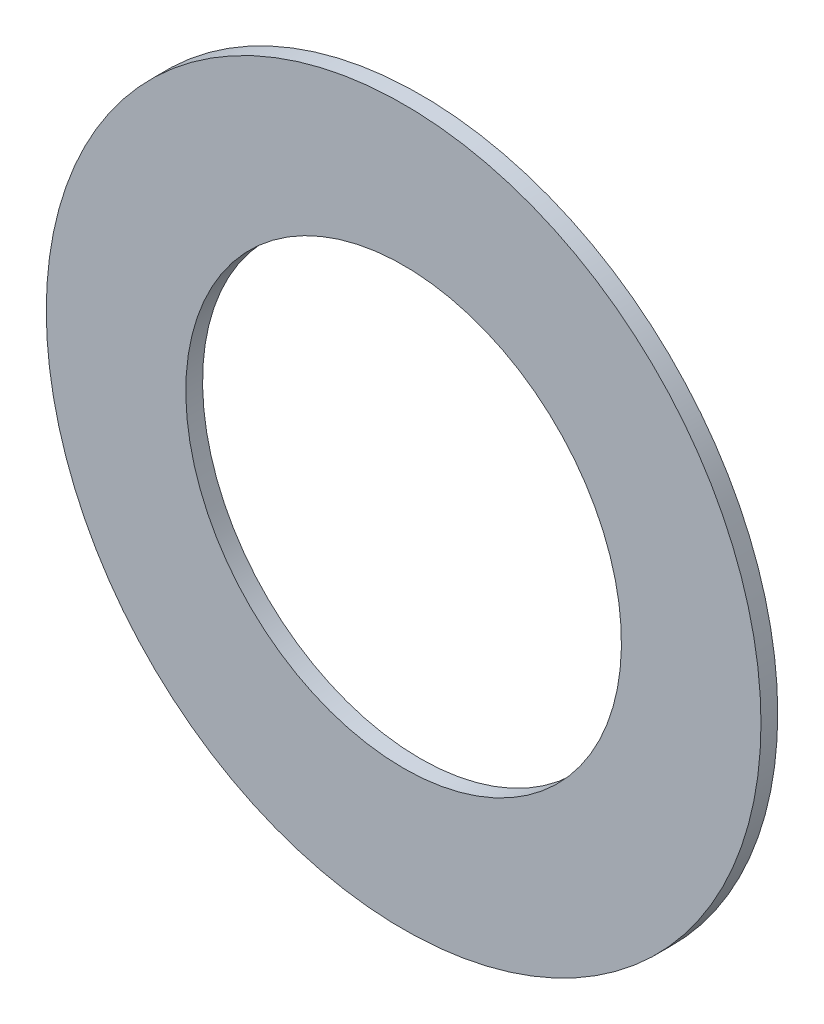
ISO-10303-21;
HEADER;
FILE_DESCRIPTION(('STEP AP214'),'2;1');
FILE_NAME('part.step','',(''),(''),'','','');
FILE_SCHEMA(('AUTOMOTIVE_DESIGN { 1 0 10303 214 1 1 1 1 }'));
ENDSEC;
DATA;
#1=APPLICATION_CONTEXT('core data for automotive mechanical design processes');
#2=APPLICATION_PROTOCOL_DEFINITION('international standard','automotive_design',2000,#1);
#3=PRODUCT_CONTEXT('',#1,'mechanical');
#4=PRODUCT('Part','Part','',(#3));
#5=PRODUCT_RELATED_PRODUCT_CATEGORY('part','',(#4));
#6=PRODUCT_DEFINITION_FORMATION('','',#4);
#7=PRODUCT_DEFINITION_CONTEXT('part definition',#1,'design');
#8=PRODUCT_DEFINITION('design','',#6,#7);
#9=PRODUCT_DEFINITION_SHAPE('','',#8);
#10=(LENGTH_UNIT() NAMED_UNIT(*) SI_UNIT(.MILLI.,.METRE.));
#11=(NAMED_UNIT(*) PLANE_ANGLE_UNIT() SI_UNIT($,.RADIAN.));
#12=(NAMED_UNIT(*) SI_UNIT($,.STERADIAN.) SOLID_ANGLE_UNIT());
#13=UNCERTAINTY_MEASURE_WITH_UNIT(LENGTH_MEASURE(1.E-05),#10,'distance_accuracy_value','');
#14=(GEOMETRIC_REPRESENTATION_CONTEXT(3) GLOBAL_UNCERTAINTY_ASSIGNED_CONTEXT((#13)) GLOBAL_UNIT_ASSIGNED_CONTEXT((#10,
#11,#12)) REPRESENTATION_CONTEXT('',''));
#15=CARTESIAN_POINT('',(0.,0.,0.));
#16=DIRECTION('',(0.,0.,1.));
#17=DIRECTION('',(1.,0.,0.));
#18=AXIS2_PLACEMENT_3D('',#15,#16,#17);
#19=CARTESIAN_POINT('',(63.17,-76.905,-0.045));
#20=DIRECTION('',(0.,0.,-1.));
#21=DIRECTION('',(0.,-1.,0.));
#22=AXIS2_PLACEMENT_3D('',#19,#20,#21);
#23=CYLINDRICAL_SURFACE('',#22,0.455);
#24=CARTESIAN_POINT('',(63.17,-76.905,1.6));
#25=DIRECTION('',(0.,0.,-1.));
#26=DIRECTION('',(0.,-1.,0.));
#27=AXIS2_PLACEMENT_3D('',#24,#25,#26);
#28=CIRCLE('',#27,0.455);
#29=CARTESIAN_POINT('',(63.17,-77.36,1.6));
#30=VERTEX_POINT('',#29);
#31=EDGE_CURVE('E26',#30,#30,#28,.T.);
#32=ORIENTED_EDGE('',*,*,#31,.T.);
#33=DIRECTION('',(0.,0.,1.));
#34=VECTOR('',#33,1.);
#35=CARTESIAN_POINT('',(63.17,-77.36,-0.045));
#36=LINE('',#35,#34);
#37=CARTESIAN_POINT('',(63.17,-77.36,1.635));
#38=VERTEX_POINT('',#37);
#39=EDGE_CURVE('E11',#30,#38,#36,.T.);
#40=ORIENTED_EDGE('',*,*,#39,.T.);
#41=CARTESIAN_POINT('',(63.17,-76.905,1.635));
#42=DIRECTION('',(0.,0.,-1.));
#43=DIRECTION('',(0.,-1.,0.));
#44=AXIS2_PLACEMENT_3D('',#41,#42,#43);
#45=CIRCLE('',#44,0.455);
#46=EDGE_CURVE('E75',#38,#38,#45,.T.);
#47=ORIENTED_EDGE('',*,*,#46,.F.);
#48=ORIENTED_EDGE('',*,*,#39,.F.);
#49=EDGE_LOOP('',(#32,#40,#47,#48));
#50=FACE_BOUND('',#49,.T.);
#51=ADVANCED_FACE('F16',(#50),#23,.F.);
#52=CARTESIAN_POINT('',(63.17,-76.905,1.6));
#53=DIRECTION('',(0.,0.,1.));
#54=DIRECTION('',(1.,0.,0.));
#55=AXIS2_PLACEMENT_3D('',#52,#53,#54);
#56=PLANE('',#55);
#57=ORIENTED_EDGE('',*,*,#31,.F.);
#58=EDGE_LOOP('',(#57));
#59=FACE_BOUND('',#58,.T.);
#60=CARTESIAN_POINT('',(63.17,-76.905,1.6));
#61=DIRECTION('',(0.,0.,1.));
#62=DIRECTION('',(1.,0.,0.));
#63=AXIS2_PLACEMENT_3D('',#60,#61,#62);
#64=CIRCLE('',#63,0.7465);
#65=CARTESIAN_POINT('',(63.9165,-76.905,1.6));
#66=VERTEX_POINT('',#65);
#67=EDGE_CURVE('E54',#66,#66,#64,.T.);
#68=ORIENTED_EDGE('',*,*,#67,.F.);
#69=EDGE_LOOP('',(#68));
#70=FACE_BOUND('',#69,.T.);
#71=ADVANCED_FACE('F103',(#59,#70),#56,.F.);
#72=CARTESIAN_POINT('',(63.17,-76.905,1.635));
#73=DIRECTION('',(0.,0.,1.));
#74=DIRECTION('',(1.,0.,0.));
#75=AXIS2_PLACEMENT_3D('',#72,#73,#74);
#76=PLANE('',#75);
#77=ORIENTED_EDGE('',*,*,#46,.T.);
#78=EDGE_LOOP('',(#77));
#79=FACE_BOUND('',#78,.T.);
#80=CARTESIAN_POINT('',(63.17,-76.905,1.635));
#81=DIRECTION('',(0.,0.,1.));
#82=DIRECTION('',(1.,0.,0.));
#83=AXIS2_PLACEMENT_3D('',#80,#81,#82);
#84=CIRCLE('',#83,0.7465);
#85=CARTESIAN_POINT('',(63.9165,-76.905,1.635));
#86=VERTEX_POINT('',#85);
#87=EDGE_CURVE('E20',#86,#86,#84,.T.);
#88=ORIENTED_EDGE('',*,*,#87,.T.);
#89=EDGE_LOOP('',(#88));
#90=FACE_BOUND('',#89,.T.);
#91=ADVANCED_FACE('F58',(#79,#90),#76,.T.);
#92=CARTESIAN_POINT('',(63.17,-76.905,1.6));
#93=DIRECTION('',(0.,0.,1.));
#94=DIRECTION('',(1.,0.,0.));
#95=AXIS2_PLACEMENT_3D('',#92,#93,#94);
#96=CYLINDRICAL_SURFACE('',#95,0.7465);
#97=ORIENTED_EDGE('',*,*,#87,.F.);
#98=DIRECTION('',(0.,0.,1.));
#99=VECTOR('',#98,1.);
#100=CARTESIAN_POINT('',(63.9165,-76.905,1.6));
#101=LINE('',#100,#99);
#102=EDGE_CURVE('E51',#66,#86,#101,.T.);
#103=ORIENTED_EDGE('',*,*,#102,.F.);
#104=ORIENTED_EDGE('',*,*,#67,.T.);
#105=ORIENTED_EDGE('',*,*,#102,.T.);
#106=EDGE_LOOP('',(#97,#103,#104,#105));
#107=FACE_BOUND('',#106,.T.);
#108=ADVANCED_FACE('F18',(#107),#96,.T.);
#109=CLOSED_SHELL('',(#51,#71,#91,#108));
#110=MANIFOLD_SOLID_BREP('B1',#109);
#111=ADVANCED_BREP_SHAPE_REPRESENTATION('',(#18,#110),#14);
#112=SHAPE_DEFINITION_REPRESENTATION(#9,#111);
ENDSEC;
END-ISO-10303-21;
